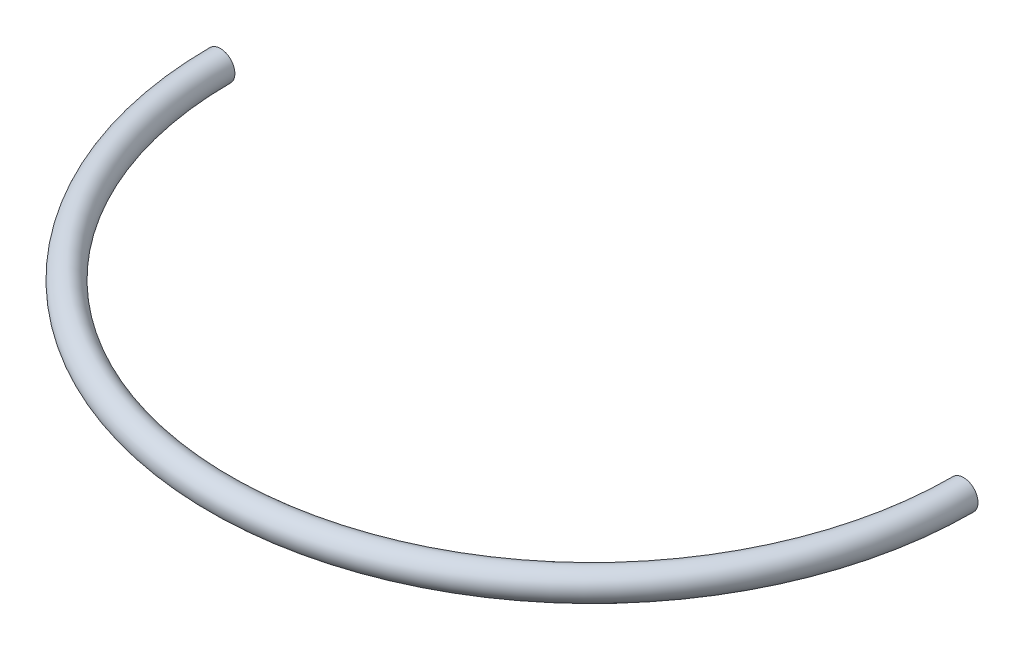
ISO-10303-21;
HEADER;
FILE_DESCRIPTION(('STEP AP214'),'2;1');
FILE_NAME('part.step','',(''),(''),'','','');
FILE_SCHEMA(('AUTOMOTIVE_DESIGN { 1 0 10303 214 1 1 1 1 }'));
ENDSEC;
DATA;
#1=APPLICATION_CONTEXT('core data for automotive mechanical design processes');
#2=APPLICATION_PROTOCOL_DEFINITION('international standard','automotive_design',2000,#1);
#3=PRODUCT_CONTEXT('',#1,'mechanical');
#4=PRODUCT('Part','Part','',(#3));
#5=PRODUCT_RELATED_PRODUCT_CATEGORY('part','',(#4));
#6=PRODUCT_DEFINITION_FORMATION('','',#4);
#7=PRODUCT_DEFINITION_CONTEXT('part definition',#1,'design');
#8=PRODUCT_DEFINITION('design','',#6,#7);
#9=PRODUCT_DEFINITION_SHAPE('','',#8);
#10=(LENGTH_UNIT() NAMED_UNIT(*) SI_UNIT(.MILLI.,.METRE.));
#11=(NAMED_UNIT(*) PLANE_ANGLE_UNIT() SI_UNIT($,.RADIAN.));
#12=(NAMED_UNIT(*) SI_UNIT($,.STERADIAN.) SOLID_ANGLE_UNIT());
#13=UNCERTAINTY_MEASURE_WITH_UNIT(LENGTH_MEASURE(1.E-05),#10,'distance_accuracy_value','');
#14=(GEOMETRIC_REPRESENTATION_CONTEXT(3) GLOBAL_UNCERTAINTY_ASSIGNED_CONTEXT((#13)) GLOBAL_UNIT_ASSIGNED_CONTEXT((#10,
#11,#12)) REPRESENTATION_CONTEXT('',''));
#15=CARTESIAN_POINT('',(0.,0.,0.));
#16=DIRECTION('',(0.,0.,1.));
#17=DIRECTION('',(1.,0.,0.));
#18=AXIS2_PLACEMENT_3D('',#15,#16,#17);
#19=CARTESIAN_POINT('',(0.,0.,0.));
#20=DIRECTION('',(0.,-1.,0.));
#21=DIRECTION('',(0.,0.,-1.));
#22=AXIS2_PLACEMENT_3D('',#19,#20,#21);
#23=TOROIDAL_SURFACE('',#22,64.,2.5);
#24=CARTESIAN_POINT('',(64.,0.,0.));
#25=DIRECTION('',(0.,0.,-1.));
#26=DIRECTION('',(-1.,0.,0.));
#27=AXIS2_PLACEMENT_3D('',#24,#25,#26);
#28=CIRCLE('',#27,2.5);
#29=CARTESIAN_POINT('',(66.5,0.,0.));
#30=VERTEX_POINT('',#29);
#31=EDGE_CURVE('E10',#30,#30,#28,.T.);
#32=CARTESIAN_POINT('',(-64.,0.,0.));
#33=DIRECTION('',(0.,0.,1.));
#34=DIRECTION('',(1.,0.,0.));
#35=AXIS2_PLACEMENT_3D('',#32,#33,#34);
#36=CIRCLE('',#35,2.5);
#37=CARTESIAN_POINT('',(-66.5,0.,0.));
#38=VERTEX_POINT('',#37);
#39=EDGE_CURVE('E37',#38,#38,#36,.T.);
#40=CARTESIAN_POINT('',(0.,0.,0.));
#41=DIRECTION('',(0.,-1.,0.));
#42=DIRECTION('',(0.,0.,-1.));
#43=AXIS2_PLACEMENT_3D('',#40,#41,#42);
#44=CIRCLE('',#43,66.5);
#45=EDGE_CURVE('',#30,#38,#44,.T.);
#46=ORIENTED_EDGE('',*,*,#31,.F.);
#47=ORIENTED_EDGE('',*,*,#39,.T.);
#48=ORIENTED_EDGE('',*,*,#45,.T.);
#49=ORIENTED_EDGE('',*,*,#45,.F.);
#50=EDGE_LOOP('',(#46,#48,#47,#49));
#51=FACE_BOUND('',#50,.T.);
#52=ADVANCED_FACE('F31',(#51),#23,.T.);
#53=CARTESIAN_POINT('',(64.,0.,0.));
#54=DIRECTION('',(0.,0.,-1.));
#55=DIRECTION('',(-1.,0.,0.));
#56=AXIS2_PLACEMENT_3D('',#53,#54,#55);
#57=PLANE('',#56);
#58=ORIENTED_EDGE('',*,*,#31,.T.);
#59=EDGE_LOOP('',(#58));
#60=FACE_BOUND('',#59,.T.);
#61=ADVANCED_FACE('F46',(#60),#57,.T.);
#62=CARTESIAN_POINT('',(-64.,0.,0.));
#63=DIRECTION('',(0.,0.,1.));
#64=DIRECTION('',(1.,0.,0.));
#65=AXIS2_PLACEMENT_3D('',#62,#63,#64);
#66=PLANE('',#65);
#67=ORIENTED_EDGE('',*,*,#39,.F.);
#68=EDGE_LOOP('',(#67));
#69=FACE_BOUND('',#68,.T.);
#70=ADVANCED_FACE('F44',(#69),#66,.F.);
#71=CLOSED_SHELL('',(#52,#61,#70));
#72=MANIFOLD_SOLID_BREP('B2',#71);
#73=ADVANCED_BREP_SHAPE_REPRESENTATION('',(#18,#72),#14);
#74=SHAPE_DEFINITION_REPRESENTATION(#9,#73);
ENDSEC;
END-ISO-10303-21;
